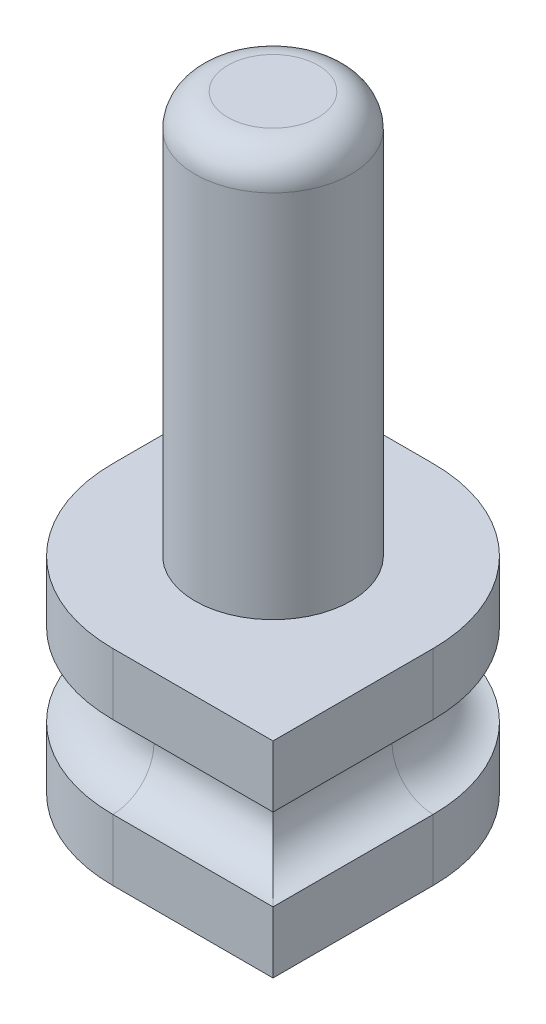
ISO-10303-21;
HEADER;
FILE_DESCRIPTION(('STEP AP214'),'2;1');
FILE_NAME('part.step','',(''),(''),'','','');
FILE_SCHEMA(('AUTOMOTIVE_DESIGN { 1 0 10303 214 1 1 1 1 }'));
ENDSEC;
DATA;
#1=APPLICATION_CONTEXT('core data for automotive mechanical design processes');
#2=APPLICATION_PROTOCOL_DEFINITION('international standard','automotive_design',2000,#1);
#3=PRODUCT_CONTEXT('',#1,'mechanical');
#4=PRODUCT('Part','Part','',(#3));
#5=PRODUCT_RELATED_PRODUCT_CATEGORY('part','',(#4));
#6=PRODUCT_DEFINITION_FORMATION('','',#4);
#7=PRODUCT_DEFINITION_CONTEXT('part definition',#1,'design');
#8=PRODUCT_DEFINITION('design','',#6,#7);
#9=PRODUCT_DEFINITION_SHAPE('','',#8);
#10=(LENGTH_UNIT() NAMED_UNIT(*) SI_UNIT(.MILLI.,.METRE.));
#11=(NAMED_UNIT(*) PLANE_ANGLE_UNIT() SI_UNIT($,.RADIAN.));
#12=(NAMED_UNIT(*) SI_UNIT($,.STERADIAN.) SOLID_ANGLE_UNIT());
#13=UNCERTAINTY_MEASURE_WITH_UNIT(LENGTH_MEASURE(1.E-05),#10,'distance_accuracy_value','');
#14=(GEOMETRIC_REPRESENTATION_CONTEXT(3) GLOBAL_UNCERTAINTY_ASSIGNED_CONTEXT((#13)) GLOBAL_UNIT_ASSIGNED_CONTEXT((#10,
#11,#12)) REPRESENTATION_CONTEXT('',''));
#15=CARTESIAN_POINT('',(0.,0.,0.));
#16=DIRECTION('',(0.,0.,1.));
#17=DIRECTION('',(1.,0.,0.));
#18=AXIS2_PLACEMENT_3D('',#15,#16,#17);
#19=CARTESIAN_POINT('',(3.9,5.,0.));
#20=DIRECTION('',(-1.,0.,0.));
#21=DIRECTION('',(0.,0.,1.));
#22=AXIS2_PLACEMENT_3D('',#19,#20,#21);
#23=PLANE('',#22);
#24=DIRECTION('',(0.,-1.,0.));
#25=VECTOR('',#24,1.);
#26=CARTESIAN_POINT('',(3.9,5.,3.9));
#27=LINE('',#26,#25);
#28=CARTESIAN_POINT('',(3.9,5.,3.9));
#29=VERTEX_POINT('',#28);
#30=CARTESIAN_POINT('',(3.9,3.5,3.9));
#31=VERTEX_POINT('',#30);
#32=EDGE_CURVE('E156',#29,#31,#27,.T.);
#33=ORIENTED_EDGE('',*,*,#32,.T.);
#34=DIRECTION('',(0.,0.,-1.));
#35=VECTOR('',#34,1.);
#36=CARTESIAN_POINT('',(3.9,3.5,0.));
#37=LINE('',#36,#35);
#38=CARTESIAN_POINT('',(3.9,3.5,0.));
#39=VERTEX_POINT('',#38);
#40=EDGE_CURVE('E288',#31,#39,#37,.T.);
#41=ORIENTED_EDGE('',*,*,#40,.T.);
#42=DIRECTION('',(0.,-1.,0.));
#43=VECTOR('',#42,1.);
#44=CARTESIAN_POINT('',(3.9,5.,0.));
#45=LINE('',#44,#43);
#46=CARTESIAN_POINT('',(3.9,5.,0.));
#47=VERTEX_POINT('',#46);
#48=EDGE_CURVE('E206',#47,#39,#45,.T.);
#49=ORIENTED_EDGE('',*,*,#48,.F.);
#50=DIRECTION('',(0.,0.,-1.));
#51=VECTOR('',#50,1.);
#52=CARTESIAN_POINT('',(3.9,5.,0.));
#53=LINE('',#52,#51);
#54=EDGE_CURVE('E166',#29,#47,#53,.T.);
#55=ORIENTED_EDGE('',*,*,#54,.F.);
#56=EDGE_LOOP('',(#33,#41,#49,#55));
#57=FACE_BOUND('',#56,.T.);
#58=ADVANCED_FACE('F33',(#57),#23,.F.);
#59=CARTESIAN_POINT('',(0.,5.,0.));
#60=DIRECTION('',(0.,-1.,0.));
#61=DIRECTION('',(0.,0.,-1.));
#62=AXIS2_PLACEMENT_3D('',#59,#60,#61);
#63=CYLINDRICAL_SURFACE('',#62,3.9);
#64=ORIENTED_EDGE('',*,*,#48,.T.);
#65=CARTESIAN_POINT('',(0.,3.5,0.));
#66=DIRECTION('',(0.,1.,0.));
#67=DIRECTION('',(0.,0.,1.));
#68=AXIS2_PLACEMENT_3D('',#65,#66,#67);
#69=CIRCLE('',#68,3.9);
#70=CARTESIAN_POINT('',(0.,3.5,-3.9));
#71=VERTEX_POINT('',#70);
#72=EDGE_CURVE('E293',#39,#71,#69,.T.);
#73=ORIENTED_EDGE('',*,*,#72,.T.);
#74=DIRECTION('',(0.,-1.,0.));
#75=VECTOR('',#74,1.);
#76=CARTESIAN_POINT('',(0.,5.,-3.9));
#77=LINE('',#76,#75);
#78=CARTESIAN_POINT('',(0.,5.,-3.9));
#79=VERTEX_POINT('',#78);
#80=EDGE_CURVE('E202',#79,#71,#77,.T.);
#81=ORIENTED_EDGE('',*,*,#80,.F.);
#82=CARTESIAN_POINT('',(0.,5.,0.));
#83=DIRECTION('',(0.,1.,0.));
#84=DIRECTION('',(0.,0.,1.));
#85=AXIS2_PLACEMENT_3D('',#82,#83,#84);
#86=CIRCLE('',#85,3.9);
#87=EDGE_CURVE('E266',#47,#79,#86,.T.);
#88=ORIENTED_EDGE('',*,*,#87,.F.);
#89=EDGE_LOOP('',(#64,#73,#81,#88));
#90=FACE_BOUND('',#89,.T.);
#91=ADVANCED_FACE('F290',(#90),#63,.T.);
#92=CARTESIAN_POINT('',(-3.9,5.,-3.9));
#93=DIRECTION('',(0.,0.,1.));
#94=DIRECTION('',(1.,0.,0.));
#95=AXIS2_PLACEMENT_3D('',#92,#93,#94);
#96=PLANE('',#95);
#97=ORIENTED_EDGE('',*,*,#80,.T.);
#98=DIRECTION('',(-1.,0.,0.));
#99=VECTOR('',#98,1.);
#100=CARTESIAN_POINT('',(-3.9,3.5,-3.9));
#101=LINE('',#100,#99);
#102=CARTESIAN_POINT('',(-3.9,3.5,-3.9));
#103=VERTEX_POINT('',#102);
#104=EDGE_CURVE('E178',#71,#103,#101,.T.);
#105=ORIENTED_EDGE('',*,*,#104,.T.);
#106=DIRECTION('',(0.,-1.,0.));
#107=VECTOR('',#106,1.);
#108=CARTESIAN_POINT('',(-3.9,5.,-3.9));
#109=LINE('',#108,#107);
#110=CARTESIAN_POINT('',(-3.9,5.,-3.9));
#111=VERTEX_POINT('',#110);
#112=EDGE_CURVE('E198',#111,#103,#109,.T.);
#113=ORIENTED_EDGE('',*,*,#112,.F.);
#114=DIRECTION('',(-1.,0.,0.));
#115=VECTOR('',#114,1.);
#116=CARTESIAN_POINT('',(-3.9,5.,-3.9));
#117=LINE('',#116,#115);
#118=EDGE_CURVE('E268',#79,#111,#117,.T.);
#119=ORIENTED_EDGE('',*,*,#118,.F.);
#120=EDGE_LOOP('',(#97,#105,#113,#119));
#121=FACE_BOUND('',#120,.T.);
#122=ADVANCED_FACE('F299',(#121),#96,.F.);
#123=CARTESIAN_POINT('',(-3.9,5.,-3.9));
#124=DIRECTION('',(1.,0.,0.));
#125=DIRECTION('',(0.,0.,-1.));
#126=AXIS2_PLACEMENT_3D('',#123,#124,#125);
#127=PLANE('',#126);
#128=ORIENTED_EDGE('',*,*,#112,.T.);
#129=DIRECTION('',(0.,0.,1.));
#130=VECTOR('',#129,1.);
#131=CARTESIAN_POINT('',(-3.9,3.5,0.));
#132=LINE('',#131,#130);
#133=CARTESIAN_POINT('',(-3.9,3.5,0.));
#134=VERTEX_POINT('',#133);
#135=EDGE_CURVE('E174',#103,#134,#132,.T.);
#136=ORIENTED_EDGE('',*,*,#135,.T.);
#137=DIRECTION('',(0.,-1.,0.));
#138=VECTOR('',#137,1.);
#139=CARTESIAN_POINT('',(-3.9,5.,0.));
#140=LINE('',#139,#138);
#141=CARTESIAN_POINT('',(-3.9,5.,0.));
#142=VERTEX_POINT('',#141);
#143=EDGE_CURVE('E194',#142,#134,#140,.T.);
#144=ORIENTED_EDGE('',*,*,#143,.F.);
#145=DIRECTION('',(0.,0.,1.));
#146=VECTOR('',#145,1.);
#147=CARTESIAN_POINT('',(-3.9,5.,-3.9));
#148=LINE('',#147,#146);
#149=EDGE_CURVE('E270',#111,#142,#148,.T.);
#150=ORIENTED_EDGE('',*,*,#149,.F.);
#151=EDGE_LOOP('',(#128,#136,#144,#150));
#152=FACE_BOUND('',#151,.T.);
#153=ADVANCED_FACE('F303',(#152),#127,.F.);
#154=CARTESIAN_POINT('',(0.,5.,0.));
#155=DIRECTION('',(0.,-1.,0.));
#156=DIRECTION('',(0.,0.,-1.));
#157=AXIS2_PLACEMENT_3D('',#154,#155,#156);
#158=CYLINDRICAL_SURFACE('',#157,3.9);
#159=ORIENTED_EDGE('',*,*,#143,.T.);
#160=CARTESIAN_POINT('',(0.,3.5,0.));
#161=DIRECTION('',(0.,1.,0.));
#162=DIRECTION('',(0.,0.,1.));
#163=AXIS2_PLACEMENT_3D('',#160,#161,#162);
#164=CIRCLE('',#163,3.9);
#165=CARTESIAN_POINT('',(0.,3.5,3.9));
#166=VERTEX_POINT('',#165);
#167=EDGE_CURVE('E308',#134,#166,#164,.T.);
#168=ORIENTED_EDGE('',*,*,#167,.T.);
#169=DIRECTION('',(0.,-1.,0.));
#170=VECTOR('',#169,1.);
#171=CARTESIAN_POINT('',(0.,5.,3.9));
#172=LINE('',#171,#170);
#173=CARTESIAN_POINT('',(0.,5.,3.9));
#174=VERTEX_POINT('',#173);
#175=EDGE_CURVE('E190',#174,#166,#172,.T.);
#176=ORIENTED_EDGE('',*,*,#175,.F.);
#177=CARTESIAN_POINT('',(0.,5.,0.));
#178=DIRECTION('',(0.,1.,0.));
#179=DIRECTION('',(0.,0.,1.));
#180=AXIS2_PLACEMENT_3D('',#177,#178,#179);
#181=CIRCLE('',#180,3.9);
#182=EDGE_CURVE('E271',#142,#174,#181,.T.);
#183=ORIENTED_EDGE('',*,*,#182,.F.);
#184=EDGE_LOOP('',(#159,#168,#176,#183));
#185=FACE_BOUND('',#184,.T.);
#186=ADVANCED_FACE('F306',(#185),#158,.T.);
#187=CARTESIAN_POINT('',(0.,5.,3.9));
#188=DIRECTION('',(0.,0.,-1.));
#189=DIRECTION('',(-1.,0.,0.));
#190=AXIS2_PLACEMENT_3D('',#187,#188,#189);
#191=PLANE('',#190);
#192=ORIENTED_EDGE('',*,*,#175,.T.);
#193=DIRECTION('',(1.,0.,0.));
#194=VECTOR('',#193,1.);
#195=CARTESIAN_POINT('',(3.9,3.5,3.9));
#196=LINE('',#195,#194);
#197=EDGE_CURVE('E283',#166,#31,#196,.T.);
#198=ORIENTED_EDGE('',*,*,#197,.T.);
#199=ORIENTED_EDGE('',*,*,#32,.F.);
#200=DIRECTION('',(1.,0.,0.));
#201=VECTOR('',#200,1.);
#202=CARTESIAN_POINT('',(0.,5.,3.9));
#203=LINE('',#202,#201);
#204=EDGE_CURVE('E157',#174,#29,#203,.T.);
#205=ORIENTED_EDGE('',*,*,#204,.F.);
#206=EDGE_LOOP('',(#192,#198,#199,#205));
#207=FACE_BOUND('',#206,.T.);
#208=ADVANCED_FACE('F281',(#207),#191,.F.);
#209=CARTESIAN_POINT('',(0.,5.,0.));
#210=DIRECTION('',(0.,1.,0.));
#211=DIRECTION('',(0.,0.,1.));
#212=AXIS2_PLACEMENT_3D('',#209,#210,#211);
#213=PLANE('',#212);
#214=CARTESIAN_POINT('',(0.,5.,0.));
#215=DIRECTION('',(0.,1.,0.));
#216=DIRECTION('',(0.,0.,1.));
#217=AXIS2_PLACEMENT_3D('',#214,#215,#216);
#218=CIRCLE('',#217,1.9);
#219=CARTESIAN_POINT('',(0.,5.,1.9));
#220=VERTEX_POINT('',#219);
#221=EDGE_CURVE('E209',#220,#220,#218,.T.);
#222=ORIENTED_EDGE('',*,*,#221,.F.);
#223=EDGE_LOOP('',(#222));
#224=FACE_BOUND('',#223,.T.);
#225=ORIENTED_EDGE('',*,*,#54,.T.);
#226=ORIENTED_EDGE('',*,*,#87,.T.);
#227=ORIENTED_EDGE('',*,*,#118,.T.);
#228=ORIENTED_EDGE('',*,*,#149,.T.);
#229=ORIENTED_EDGE('',*,*,#182,.T.);
#230=ORIENTED_EDGE('',*,*,#204,.T.);
#231=EDGE_LOOP('',(#225,#226,#227,#228,#229,#230));
#232=FACE_BOUND('',#231,.T.);
#233=ADVANCED_FACE('F277',(#224,#232),#213,.T.);
#234=CARTESIAN_POINT('',(0.,14.8,0.));
#235=DIRECTION('',(0.,-1.,0.));
#236=DIRECTION('',(0.,0.,-1.));
#237=AXIS2_PLACEMENT_3D('',#234,#235,#236);
#238=CYLINDRICAL_SURFACE('',#237,1.9);
#239=CARTESIAN_POINT('',(0.,14.,0.));
#240=DIRECTION('',(0.,1.,0.));
#241=DIRECTION('',(0.,0.,1.));
#242=AXIS2_PLACEMENT_3D('',#239,#240,#241);
#243=CIRCLE('',#242,1.9);
#244=CARTESIAN_POINT('',(0.,14.,1.9));
#245=VERTEX_POINT('',#244);
#246=EDGE_CURVE('E11',#245,#245,#243,.F.);
#247=ORIENTED_EDGE('',*,*,#246,.T.);
#248=EDGE_LOOP('',(#247));
#249=FACE_BOUND('',#248,.T.);
#250=ORIENTED_EDGE('',*,*,#221,.T.);
#251=EDGE_LOOP('',(#250));
#252=FACE_BOUND('',#251,.T.);
#253=ADVANCED_FACE('F398',(#249,#252),#238,.T.);
#254=CARTESIAN_POINT('',(0.,14.8,0.));
#255=DIRECTION('',(0.,1.,0.));
#256=DIRECTION('',(0.,0.,1.));
#257=AXIS2_PLACEMENT_3D('',#254,#255,#256);
#258=PLANE('',#257);
#259=CARTESIAN_POINT('',(0.,14.8,0.));
#260=DIRECTION('',(0.,1.,0.));
#261=DIRECTION('',(0.,0.,1.));
#262=AXIS2_PLACEMENT_3D('',#259,#260,#261);
#263=CIRCLE('',#262,1.1);
#264=CARTESIAN_POINT('',(0.,14.8,1.1));
#265=VERTEX_POINT('',#264);
#266=EDGE_CURVE('E42',#265,#265,#263,.T.);
#267=ORIENTED_EDGE('',*,*,#266,.T.);
#268=EDGE_LOOP('',(#267));
#269=FACE_BOUND('',#268,.T.);
#270=ADVANCED_FACE('F395',(#269),#258,.T.);
#271=CARTESIAN_POINT('',(0.,0.,0.));
#272=DIRECTION('',(0.,1.,0.));
#273=DIRECTION('',(0.,0.,1.));
#274=AXIS2_PLACEMENT_3D('',#271,#272,#273);
#275=PLANE('',#274);
#276=DIRECTION('',(0.,0.,-1.));
#277=VECTOR('',#276,1.);
#278=CARTESIAN_POINT('',(3.9,0.,0.));
#279=LINE('',#278,#277);
#280=CARTESIAN_POINT('',(3.9,0.,3.9));
#281=VERTEX_POINT('',#280);
#282=CARTESIAN_POINT('',(3.9,0.,0.));
#283=VERTEX_POINT('',#282);
#284=EDGE_CURVE('E154',#281,#283,#279,.T.);
#285=ORIENTED_EDGE('',*,*,#284,.F.);
#286=DIRECTION('',(1.,0.,0.));
#287=VECTOR('',#286,1.);
#288=CARTESIAN_POINT('',(0.,0.,3.9));
#289=LINE('',#288,#287);
#290=CARTESIAN_POINT('',(0.,0.,3.9));
#291=VERTEX_POINT('',#290);
#292=EDGE_CURVE('E160',#291,#281,#289,.T.);
#293=ORIENTED_EDGE('',*,*,#292,.F.);
#294=CARTESIAN_POINT('',(0.,0.,0.));
#295=DIRECTION('',(0.,1.,0.));
#296=DIRECTION('',(0.,0.,1.));
#297=AXIS2_PLACEMENT_3D('',#294,#295,#296);
#298=CIRCLE('',#297,3.9);
#299=CARTESIAN_POINT('',(-3.9,0.,0.));
#300=VERTEX_POINT('',#299);
#301=EDGE_CURVE('E167',#300,#291,#298,.T.);
#302=ORIENTED_EDGE('',*,*,#301,.F.);
#303=DIRECTION('',(0.,0.,1.));
#304=VECTOR('',#303,1.);
#305=CARTESIAN_POINT('',(-3.9,0.,-3.9));
#306=LINE('',#305,#304);
#307=CARTESIAN_POINT('',(-3.9,0.,-3.9));
#308=VERTEX_POINT('',#307);
#309=EDGE_CURVE('E185',#308,#300,#306,.T.);
#310=ORIENTED_EDGE('',*,*,#309,.F.);
#311=DIRECTION('',(-1.,0.,0.));
#312=VECTOR('',#311,1.);
#313=CARTESIAN_POINT('',(-3.9,0.,-3.9));
#314=LINE('',#313,#312);
#315=CARTESIAN_POINT('',(0.,0.,-3.9));
#316=VERTEX_POINT('',#315);
#317=EDGE_CURVE('E176',#316,#308,#314,.T.);
#318=ORIENTED_EDGE('',*,*,#317,.F.);
#319=CARTESIAN_POINT('',(0.,0.,0.));
#320=DIRECTION('',(0.,1.,0.));
#321=DIRECTION('',(0.,0.,1.));
#322=AXIS2_PLACEMENT_3D('',#319,#320,#321);
#323=CIRCLE('',#322,3.9);
#324=EDGE_CURVE('E173',#283,#316,#323,.T.);
#325=ORIENTED_EDGE('',*,*,#324,.F.);
#326=EDGE_LOOP('',(#285,#293,#302,#310,#318,#325));
#327=FACE_BOUND('',#326,.T.);
#328=ADVANCED_FACE('F170',(#327),#275,.F.);
#329=DIRECTION('',(1.,0.,0.));
#330=VECTOR('',#329,1.);
#331=CARTESIAN_POINT('',(3.9,1.5,3.9));
#332=LINE('',#331,#330);
#333=CARTESIAN_POINT('',(0.,1.5,3.9));
#334=VERTEX_POINT('',#333);
#335=CARTESIAN_POINT('',(3.9,1.5,3.9));
#336=VERTEX_POINT('',#335);
#337=EDGE_CURVE('E50',#334,#336,#332,.T.);
#338=ORIENTED_EDGE('',*,*,#337,.F.);
#339=EDGE_CURVE('E162',#334,#291,#172,.T.);
#340=ORIENTED_EDGE('',*,*,#339,.T.);
#341=ORIENTED_EDGE('',*,*,#292,.T.);
#342=EDGE_CURVE('E149',#336,#281,#27,.T.);
#343=ORIENTED_EDGE('',*,*,#342,.F.);
#344=EDGE_LOOP('',(#338,#340,#341,#343));
#345=FACE_BOUND('',#344,.T.);
#346=ADVANCED_FACE('F161',(#345),#191,.F.);
#347=CARTESIAN_POINT('',(0.,1.5,0.));
#348=DIRECTION('',(0.,1.,0.));
#349=DIRECTION('',(0.,0.,1.));
#350=AXIS2_PLACEMENT_3D('',#347,#348,#349);
#351=CIRCLE('',#350,3.9);
#352=CARTESIAN_POINT('',(-3.9,1.5,0.));
#353=VERTEX_POINT('',#352);
#354=EDGE_CURVE('E254',#353,#334,#351,.T.);
#355=ORIENTED_EDGE('',*,*,#354,.F.);
#356=EDGE_CURVE('E193',#353,#300,#140,.T.);
#357=ORIENTED_EDGE('',*,*,#356,.T.);
#358=ORIENTED_EDGE('',*,*,#301,.T.);
#359=ORIENTED_EDGE('',*,*,#339,.F.);
#360=EDGE_LOOP('',(#355,#357,#358,#359));
#361=FACE_BOUND('',#360,.T.);
#362=ADVANCED_FACE('F390',(#361),#158,.T.);
#363=DIRECTION('',(0.,0.,1.));
#364=VECTOR('',#363,1.);
#365=CARTESIAN_POINT('',(-3.9,1.5,0.));
#366=LINE('',#365,#364);
#367=CARTESIAN_POINT('',(-3.9,1.5,-3.9));
#368=VERTEX_POINT('',#367);
#369=EDGE_CURVE('E318',#368,#353,#366,.T.);
#370=ORIENTED_EDGE('',*,*,#369,.F.);
#371=EDGE_CURVE('E197',#368,#308,#109,.T.);
#372=ORIENTED_EDGE('',*,*,#371,.T.);
#373=ORIENTED_EDGE('',*,*,#309,.T.);
#374=ORIENTED_EDGE('',*,*,#356,.F.);
#375=EDGE_LOOP('',(#370,#372,#373,#374));
#376=FACE_BOUND('',#375,.T.);
#377=ADVANCED_FACE('F381',(#376),#127,.F.);
#378=DIRECTION('',(-1.,0.,0.));
#379=VECTOR('',#378,1.);
#380=CARTESIAN_POINT('',(-3.9,1.5,-3.9));
#381=LINE('',#380,#379);
#382=CARTESIAN_POINT('',(0.,1.5,-3.9));
#383=VERTEX_POINT('',#382);
#384=EDGE_CURVE('E323',#383,#368,#381,.T.);
#385=ORIENTED_EDGE('',*,*,#384,.F.);
#386=EDGE_CURVE('E201',#383,#316,#77,.T.);
#387=ORIENTED_EDGE('',*,*,#386,.T.);
#388=ORIENTED_EDGE('',*,*,#317,.T.);
#389=ORIENTED_EDGE('',*,*,#371,.F.);
#390=EDGE_LOOP('',(#385,#387,#388,#389));
#391=FACE_BOUND('',#390,.T.);
#392=ADVANCED_FACE('F376',(#391),#96,.F.);
#393=CARTESIAN_POINT('',(0.,1.5,0.));
#394=DIRECTION('',(0.,1.,0.));
#395=DIRECTION('',(0.,0.,1.));
#396=AXIS2_PLACEMENT_3D('',#393,#394,#395);
#397=CIRCLE('',#396,3.9);
#398=CARTESIAN_POINT('',(3.9,1.5,0.));
#399=VERTEX_POINT('',#398);
#400=EDGE_CURVE('E326',#399,#383,#397,.T.);
#401=ORIENTED_EDGE('',*,*,#400,.F.);
#402=EDGE_CURVE('E205',#399,#283,#45,.T.);
#403=ORIENTED_EDGE('',*,*,#402,.T.);
#404=ORIENTED_EDGE('',*,*,#324,.T.);
#405=ORIENTED_EDGE('',*,*,#386,.F.);
#406=EDGE_LOOP('',(#401,#403,#404,#405));
#407=FACE_BOUND('',#406,.T.);
#408=ADVANCED_FACE('F369',(#407),#63,.T.);
#409=DIRECTION('',(0.,0.,-1.));
#410=VECTOR('',#409,1.);
#411=CARTESIAN_POINT('',(3.9,1.5,0.));
#412=LINE('',#411,#410);
#413=EDGE_CURVE('E155',#336,#399,#412,.T.);
#414=ORIENTED_EDGE('',*,*,#413,.F.);
#415=ORIENTED_EDGE('',*,*,#342,.T.);
#416=ORIENTED_EDGE('',*,*,#284,.T.);
#417=ORIENTED_EDGE('',*,*,#402,.F.);
#418=EDGE_LOOP('',(#414,#415,#416,#417));
#419=FACE_BOUND('',#418,.T.);
#420=ADVANCED_FACE('F151',(#419),#23,.F.);
#421=CARTESIAN_POINT('',(-3.9,2.5,0.));
#422=DIRECTION('',(0.,0.,1.));
#423=DIRECTION('',(1.,0.,0.));
#424=AXIS2_PLACEMENT_3D('',#421,#422,#423);
#425=CYLINDRICAL_SURFACE('',#424,1.);
#426=CARTESIAN_POINT('',(-3.9,2.5,-3.9));
#427=DIRECTION('',(-0.707106781186547,0.,0.707106781186547));
#428=DIRECTION('',(-0.707106781186547,0.,-0.707106781186547));
#429=AXIS2_PLACEMENT_3D('',#426,#427,#428);
#430=ELLIPSE('',#429,1.41421356237309,1.);
#431=CARTESIAN_POINT('',(-2.9,2.5,-2.9));
#432=VERTEX_POINT('',#431);
#433=EDGE_CURVE('E251',#368,#432,#430,.T.);
#434=ORIENTED_EDGE('',*,*,#433,.F.);
#435=ORIENTED_EDGE('',*,*,#369,.T.);
#436=CARTESIAN_POINT('',(-3.9,2.5,0.));
#437=DIRECTION('',(0.,0.,-1.));
#438=DIRECTION('',(-1.,0.,0.));
#439=AXIS2_PLACEMENT_3D('',#436,#437,#438);
#440=CIRCLE('',#439,1.);
#441=CARTESIAN_POINT('',(-2.9,2.5,0.));
#442=VERTEX_POINT('',#441);
#443=EDGE_CURVE('E79',#442,#353,#440,.T.);
#444=ORIENTED_EDGE('',*,*,#443,.F.);
#445=DIRECTION('',(0.,0.,1.));
#446=VECTOR('',#445,1.);
#447=CARTESIAN_POINT('',(-2.9,2.5,0.));
#448=LINE('',#447,#446);
#449=EDGE_CURVE('E74',#432,#442,#448,.T.);
#450=ORIENTED_EDGE('',*,*,#449,.F.);
#451=EDGE_LOOP('',(#434,#435,#444,#450));
#452=FACE_BOUND('',#451,.T.);
#453=ADVANCED_FACE('F361',(#452),#425,.F.);
#454=CARTESIAN_POINT('',(0.,2.5,0.));
#455=DIRECTION('',(0.,1.,0.));
#456=DIRECTION('',(0.,0.,1.));
#457=AXIS2_PLACEMENT_3D('',#454,#455,#456);
#458=TOROIDAL_SURFACE('',#457,3.9,1.);
#459=ORIENTED_EDGE('',*,*,#443,.T.);
#460=ORIENTED_EDGE('',*,*,#354,.T.);
#461=CARTESIAN_POINT('',(0.,2.5,3.9));
#462=DIRECTION('',(-1.,0.,0.));
#463=DIRECTION('',(0.,0.,1.));
#464=AXIS2_PLACEMENT_3D('',#461,#462,#463);
#465=CIRCLE('',#464,1.);
#466=CARTESIAN_POINT('',(0.,2.5,2.9));
#467=VERTEX_POINT('',#466);
#468=EDGE_CURVE('E248',#467,#334,#465,.T.);
#469=ORIENTED_EDGE('',*,*,#468,.F.);
#470=CARTESIAN_POINT('',(0.,2.5,0.));
#471=DIRECTION('',(0.,1.,0.));
#472=DIRECTION('',(0.,0.,1.));
#473=AXIS2_PLACEMENT_3D('',#470,#471,#472);
#474=CIRCLE('',#473,2.9);
#475=EDGE_CURVE('E245',#442,#467,#474,.T.);
#476=ORIENTED_EDGE('',*,*,#475,.F.);
#477=EDGE_LOOP('',(#459,#460,#469,#476));
#478=FACE_BOUND('',#477,.T.);
#479=ADVANCED_FACE('F333',(#478),#458,.F.);
#480=CARTESIAN_POINT('',(-3.9,2.5,0.));
#481=DIRECTION('',(0.,0.,-1.));
#482=DIRECTION('',(-1.,0.,0.));
#483=AXIS2_PLACEMENT_3D('',#480,#481,#482);
#484=CYLINDRICAL_SURFACE('',#483,1.);
#485=CARTESIAN_POINT('',(-3.9,2.5,-3.9));
#486=DIRECTION('',(0.707106781186547,0.,-0.707106781186547));
#487=DIRECTION('',(-0.707106781186547,0.,-0.707106781186547));
#488=AXIS2_PLACEMENT_3D('',#485,#486,#487);
#489=ELLIPSE('',#488,1.41421356237309,1.);
#490=EDGE_CURVE('E239',#432,#103,#489,.F.);
#491=ORIENTED_EDGE('',*,*,#490,.F.);
#492=ORIENTED_EDGE('',*,*,#449,.T.);
#493=CARTESIAN_POINT('',(-3.9,2.5,0.));
#494=DIRECTION('',(0.,0.,-1.));
#495=DIRECTION('',(-1.,0.,0.));
#496=AXIS2_PLACEMENT_3D('',#493,#494,#495);
#497=CIRCLE('',#496,1.);
#498=EDGE_CURVE('E242',#134,#442,#497,.T.);
#499=ORIENTED_EDGE('',*,*,#498,.F.);
#500=ORIENTED_EDGE('',*,*,#135,.F.);
#501=EDGE_LOOP('',(#491,#492,#499,#500));
#502=FACE_BOUND('',#501,.T.);
#503=ADVANCED_FACE('F351',(#502),#484,.F.);
#504=CARTESIAN_POINT('',(-2.9,2.5,-3.9));
#505=DIRECTION('',(-1.,0.,0.));
#506=DIRECTION('',(0.,0.,1.));
#507=AXIS2_PLACEMENT_3D('',#504,#505,#506);
#508=CYLINDRICAL_SURFACE('',#507,1.);
#509=ORIENTED_EDGE('',*,*,#384,.T.);
#510=ORIENTED_EDGE('',*,*,#433,.T.);
#511=DIRECTION('',(-1.,0.,0.));
#512=VECTOR('',#511,1.);
#513=CARTESIAN_POINT('',(-2.9,2.5,-2.9));
#514=LINE('',#513,#512);
#515=CARTESIAN_POINT('',(0.,2.5,-2.9));
#516=VERTEX_POINT('',#515);
#517=EDGE_CURVE('E236',#516,#432,#514,.T.);
#518=ORIENTED_EDGE('',*,*,#517,.F.);
#519=CARTESIAN_POINT('',(0.,2.5,-3.9));
#520=DIRECTION('',(-1.,0.,0.));
#521=DIRECTION('',(0.,0.,1.));
#522=AXIS2_PLACEMENT_3D('',#519,#520,#521);
#523=CIRCLE('',#522,1.);
#524=EDGE_CURVE('E233',#383,#516,#523,.T.);
#525=ORIENTED_EDGE('',*,*,#524,.F.);
#526=EDGE_LOOP('',(#509,#510,#518,#525));
#527=FACE_BOUND('',#526,.T.);
#528=ADVANCED_FACE('F353',(#527),#508,.F.);
#529=CARTESIAN_POINT('',(2.9,2.5,3.9));
#530=DIRECTION('',(1.,0.,0.));
#531=DIRECTION('',(0.,0.,-1.));
#532=AXIS2_PLACEMENT_3D('',#529,#530,#531);
#533=CYLINDRICAL_SURFACE('',#532,1.);
#534=ORIENTED_EDGE('',*,*,#468,.T.);
#535=ORIENTED_EDGE('',*,*,#337,.T.);
#536=CARTESIAN_POINT('',(3.9,2.5,3.9));
#537=DIRECTION('',(0.707106781186547,0.,-0.707106781186547));
#538=DIRECTION('',(0.707106781186547,0.,0.707106781186547));
#539=AXIS2_PLACEMENT_3D('',#536,#537,#538);
#540=ELLIPSE('',#539,1.41421356237309,1.);
#541=CARTESIAN_POINT('',(2.9,2.5,2.9));
#542=VERTEX_POINT('',#541);
#543=EDGE_CURVE('E86',#542,#336,#540,.F.);
#544=ORIENTED_EDGE('',*,*,#543,.F.);
#545=DIRECTION('',(1.,0.,0.));
#546=VECTOR('',#545,1.);
#547=CARTESIAN_POINT('',(2.9,2.5,2.9));
#548=LINE('',#547,#546);
#549=EDGE_CURVE('E227',#467,#542,#548,.T.);
#550=ORIENTED_EDGE('',*,*,#549,.F.);
#551=EDGE_LOOP('',(#534,#535,#544,#550));
#552=FACE_BOUND('',#551,.T.);
#553=ADVANCED_FACE('F337',(#552),#533,.F.);
#554=CARTESIAN_POINT('',(0.,2.5,0.));
#555=DIRECTION('',(0.,1.,0.));
#556=DIRECTION('',(0.,0.,1.));
#557=AXIS2_PLACEMENT_3D('',#554,#555,#556);
#558=TOROIDAL_SURFACE('',#557,3.9,1.);
#559=ORIENTED_EDGE('',*,*,#498,.T.);
#560=ORIENTED_EDGE('',*,*,#475,.T.);
#561=CARTESIAN_POINT('',(0.,2.5,3.9));
#562=DIRECTION('',(-1.,0.,0.));
#563=DIRECTION('',(0.,0.,1.));
#564=AXIS2_PLACEMENT_3D('',#561,#562,#563);
#565=CIRCLE('',#564,1.);
#566=EDGE_CURVE('E224',#166,#467,#565,.T.);
#567=ORIENTED_EDGE('',*,*,#566,.F.);
#568=ORIENTED_EDGE('',*,*,#167,.F.);
#569=EDGE_LOOP('',(#559,#560,#567,#568));
#570=FACE_BOUND('',#569,.T.);
#571=ADVANCED_FACE('F311',(#570),#558,.F.);
#572=CARTESIAN_POINT('',(0.,2.5,-3.9));
#573=DIRECTION('',(1.,0.,0.));
#574=DIRECTION('',(0.,0.,-1.));
#575=AXIS2_PLACEMENT_3D('',#572,#573,#574);
#576=CYLINDRICAL_SURFACE('',#575,1.);
#577=ORIENTED_EDGE('',*,*,#490,.T.);
#578=ORIENTED_EDGE('',*,*,#104,.F.);
#579=CARTESIAN_POINT('',(0.,2.5,-3.9));
#580=DIRECTION('',(-1.,0.,0.));
#581=DIRECTION('',(0.,0.,1.));
#582=AXIS2_PLACEMENT_3D('',#579,#580,#581);
#583=CIRCLE('',#582,1.);
#584=EDGE_CURVE('E221',#516,#71,#583,.T.);
#585=ORIENTED_EDGE('',*,*,#584,.F.);
#586=ORIENTED_EDGE('',*,*,#517,.T.);
#587=EDGE_LOOP('',(#577,#578,#585,#586));
#588=FACE_BOUND('',#587,.T.);
#589=ADVANCED_FACE('F348',(#588),#576,.F.);
#590=CARTESIAN_POINT('',(0.,2.5,0.));
#591=DIRECTION('',(0.,1.,0.));
#592=DIRECTION('',(0.,0.,1.));
#593=AXIS2_PLACEMENT_3D('',#590,#591,#592);
#594=TOROIDAL_SURFACE('',#593,3.9,1.);
#595=CARTESIAN_POINT('',(3.9,2.5,0.));
#596=DIRECTION('',(0.,0.,-1.));
#597=DIRECTION('',(-1.,0.,0.));
#598=AXIS2_PLACEMENT_3D('',#595,#596,#597);
#599=CIRCLE('',#598,1.);
#600=CARTESIAN_POINT('',(2.9,2.5,0.));
#601=VERTEX_POINT('',#600);
#602=EDGE_CURVE('E231',#399,#601,#599,.T.);
#603=ORIENTED_EDGE('',*,*,#602,.F.);
#604=ORIENTED_EDGE('',*,*,#400,.T.);
#605=ORIENTED_EDGE('',*,*,#524,.T.);
#606=CARTESIAN_POINT('',(0.,2.5,0.));
#607=DIRECTION('',(0.,1.,0.));
#608=DIRECTION('',(0.,0.,1.));
#609=AXIS2_PLACEMENT_3D('',#606,#607,#608);
#610=CIRCLE('',#609,2.9);
#611=EDGE_CURVE('E218',#601,#516,#610,.T.);
#612=ORIENTED_EDGE('',*,*,#611,.F.);
#613=EDGE_LOOP('',(#603,#604,#605,#612));
#614=FACE_BOUND('',#613,.T.);
#615=ADVANCED_FACE('F490',(#614),#594,.F.);
#616=CARTESIAN_POINT('',(3.9,2.5,0.));
#617=DIRECTION('',(0.,0.,-1.));
#618=DIRECTION('',(-1.,0.,0.));
#619=AXIS2_PLACEMENT_3D('',#616,#617,#618);
#620=CYLINDRICAL_SURFACE('',#619,1.);
#621=ORIENTED_EDGE('',*,*,#413,.T.);
#622=ORIENTED_EDGE('',*,*,#602,.T.);
#623=DIRECTION('',(0.,0.,-1.));
#624=VECTOR('',#623,1.);
#625=CARTESIAN_POINT('',(2.9,2.5,0.));
#626=LINE('',#625,#624);
#627=EDGE_CURVE('E215',#542,#601,#626,.T.);
#628=ORIENTED_EDGE('',*,*,#627,.F.);
#629=ORIENTED_EDGE('',*,*,#543,.T.);
#630=EDGE_LOOP('',(#621,#622,#628,#629));
#631=FACE_BOUND('',#630,.T.);
#632=ADVANCED_FACE('F338',(#631),#620,.F.);
#633=CARTESIAN_POINT('',(0.,2.5,3.9));
#634=DIRECTION('',(-1.,0.,0.));
#635=DIRECTION('',(0.,0.,1.));
#636=AXIS2_PLACEMENT_3D('',#633,#634,#635);
#637=CYLINDRICAL_SURFACE('',#636,1.);
#638=ORIENTED_EDGE('',*,*,#566,.T.);
#639=ORIENTED_EDGE('',*,*,#549,.T.);
#640=CARTESIAN_POINT('',(3.9,2.5,3.9));
#641=DIRECTION('',(-0.707106781186547,0.,0.707106781186547));
#642=DIRECTION('',(-0.707106781186547,0.,-0.707106781186547));
#643=AXIS2_PLACEMENT_3D('',#640,#641,#642);
#644=ELLIPSE('',#643,1.41421356237309,1.);
#645=EDGE_CURVE('E212',#31,#542,#644,.T.);
#646=ORIENTED_EDGE('',*,*,#645,.F.);
#647=ORIENTED_EDGE('',*,*,#197,.F.);
#648=EDGE_LOOP('',(#638,#639,#646,#647));
#649=FACE_BOUND('',#648,.T.);
#650=ADVANCED_FACE('F315',(#649),#637,.F.);
#651=CARTESIAN_POINT('',(0.,2.5,0.));
#652=DIRECTION('',(0.,1.,0.));
#653=DIRECTION('',(0.,0.,1.));
#654=AXIS2_PLACEMENT_3D('',#651,#652,#653);
#655=TOROIDAL_SURFACE('',#654,3.9,1.);
#656=ORIENTED_EDGE('',*,*,#584,.T.);
#657=ORIENTED_EDGE('',*,*,#72,.F.);
#658=CARTESIAN_POINT('',(3.9,2.5,0.));
#659=DIRECTION('',(0.,0.,-1.));
#660=DIRECTION('',(0.,1.,0.));
#661=AXIS2_PLACEMENT_3D('',#658,#659,#660);
#662=CIRCLE('',#661,1.);
#663=EDGE_CURVE('E210',#601,#39,#662,.T.);
#664=ORIENTED_EDGE('',*,*,#663,.F.);
#665=ORIENTED_EDGE('',*,*,#611,.T.);
#666=EDGE_LOOP('',(#656,#657,#664,#665));
#667=FACE_BOUND('',#666,.T.);
#668=ADVANCED_FACE('F345',(#667),#655,.F.);
#669=CARTESIAN_POINT('',(3.9,2.5,0.));
#670=DIRECTION('',(0.,0.,1.));
#671=DIRECTION('',(1.,0.,0.));
#672=AXIS2_PLACEMENT_3D('',#669,#670,#671);
#673=CYLINDRICAL_SURFACE('',#672,1.);
#674=ORIENTED_EDGE('',*,*,#645,.T.);
#675=ORIENTED_EDGE('',*,*,#627,.T.);
#676=ORIENTED_EDGE('',*,*,#663,.T.);
#677=ORIENTED_EDGE('',*,*,#40,.F.);
#678=EDGE_LOOP('',(#674,#675,#676,#677));
#679=FACE_BOUND('',#678,.T.);
#680=ADVANCED_FACE('F343',(#679),#673,.F.);
#681=CARTESIAN_POINT('',(0.,14.,0.));
#682=DIRECTION('',(0.,1.,0.));
#683=DIRECTION('',(0.,0.,1.));
#684=AXIS2_PLACEMENT_3D('',#681,#682,#683);
#685=TOROIDAL_SURFACE('',#684,1.1,0.8);
#686=ORIENTED_EDGE('',*,*,#246,.F.);
#687=EDGE_LOOP('',(#686));
#688=FACE_BOUND('',#687,.T.);
#689=ORIENTED_EDGE('',*,*,#266,.F.);
#690=EDGE_LOOP('',(#689));
#691=FACE_BOUND('',#690,.T.);
#692=ADVANCED_FACE('F35',(#688,#691),#685,.T.);
#693=CLOSED_SHELL('',(#58,#91,#122,#153,#186,#208,#233,#253,#270,#328,#346,#362,#377,#392,#408,
#420,#453,#479,#503,#528,#553,#571,#589,#615,#632,#650,#668,#680,#692));
#694=MANIFOLD_SOLID_BREP('B2',#693);
#695=ADVANCED_BREP_SHAPE_REPRESENTATION('',(#18,#694),#14);
#696=SHAPE_DEFINITION_REPRESENTATION(#9,#695);
ENDSEC;
END-ISO-10303-21;
